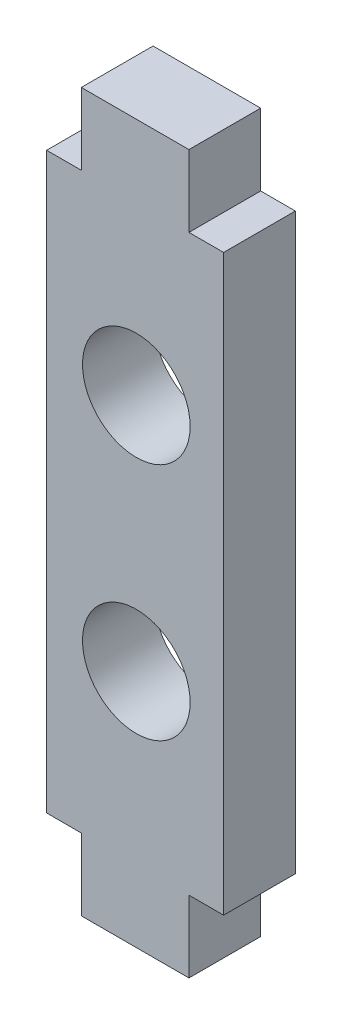
ISO-10303-21;
HEADER;
FILE_DESCRIPTION(('STEP AP214'),'2;1');
FILE_NAME('part.step','',(''),(''),'','','');
FILE_SCHEMA(('AUTOMOTIVE_DESIGN { 1 0 10303 214 1 1 1 1 }'));
ENDSEC;
DATA;
#1=APPLICATION_CONTEXT('core data for automotive mechanical design processes');
#2=APPLICATION_PROTOCOL_DEFINITION('international standard','automotive_design',2000,#1);
#3=PRODUCT_CONTEXT('',#1,'mechanical');
#4=PRODUCT('Part','Part','',(#3));
#5=PRODUCT_RELATED_PRODUCT_CATEGORY('part','',(#4));
#6=PRODUCT_DEFINITION_FORMATION('','',#4);
#7=PRODUCT_DEFINITION_CONTEXT('part definition',#1,'design');
#8=PRODUCT_DEFINITION('design','',#6,#7);
#9=PRODUCT_DEFINITION_SHAPE('','',#8);
#10=(LENGTH_UNIT() NAMED_UNIT(*) SI_UNIT(.MILLI.,.METRE.));
#11=(NAMED_UNIT(*) PLANE_ANGLE_UNIT() SI_UNIT($,.RADIAN.));
#12=(NAMED_UNIT(*) SI_UNIT($,.STERADIAN.) SOLID_ANGLE_UNIT());
#13=UNCERTAINTY_MEASURE_WITH_UNIT(LENGTH_MEASURE(1.E-05),#10,'distance_accuracy_value','');
#14=(GEOMETRIC_REPRESENTATION_CONTEXT(3) GLOBAL_UNCERTAINTY_ASSIGNED_CONTEXT((#13)) GLOBAL_UNIT_ASSIGNED_CONTEXT((#10,
#11,#12)) REPRESENTATION_CONTEXT('',''));
#15=CARTESIAN_POINT('',(0.,0.,0.));
#16=DIRECTION('',(0.,0.,1.));
#17=DIRECTION('',(1.,0.,0.));
#18=AXIS2_PLACEMENT_3D('',#15,#16,#17);
#19=CARTESIAN_POINT('',(0.,0.,3.));
#20=DIRECTION('',(0.,0.,1.));
#21=DIRECTION('',(1.,0.,0.));
#22=AXIS2_PLACEMENT_3D('',#19,#20,#21);
#23=PLANE('',#22);
#24=CARTESIAN_POINT('',(3.75,0.,3.));
#25=DIRECTION('',(0.,0.,1.));
#26=DIRECTION('',(1.,0.,0.));
#27=AXIS2_PLACEMENT_3D('',#24,#25,#26);
#28=CIRCLE('',#27,2.25);
#29=CARTESIAN_POINT('',(6.00000000000001,0.,3.));
#30=VERTEX_POINT('',#29);
#31=EDGE_CURVE('E173',#30,#30,#28,.T.);
#32=ORIENTED_EDGE('',*,*,#31,.F.);
#33=EDGE_LOOP('',(#32));
#34=FACE_BOUND('',#33,.T.);
#35=DIRECTION('',(0.,-1.,0.));
#36=VECTOR('',#35,1.);
#37=CARTESIAN_POINT('',(0.,0.,3.));
#38=LINE('',#37,#36);
#39=CARTESIAN_POINT('',(0.,7.,3.));
#40=VERTEX_POINT('',#39);
#41=CARTESIAN_POINT('',(0.,-17.,3.));
#42=VERTEX_POINT('',#41);
#43=EDGE_CURVE('E57',#40,#42,#38,.T.);
#44=ORIENTED_EDGE('',*,*,#43,.T.);
#45=DIRECTION('',(1.,0.,0.));
#46=VECTOR('',#45,1.);
#47=CARTESIAN_POINT('',(0.,-17.,3.));
#48=LINE('',#47,#46);
#49=CARTESIAN_POINT('',(1.45,-17.,3.));
#50=VERTEX_POINT('',#49);
#51=EDGE_CURVE('E113',#42,#50,#48,.T.);
#52=ORIENTED_EDGE('',*,*,#51,.T.);
#53=DIRECTION('',(0.,-1.,0.));
#54=VECTOR('',#53,1.);
#55=CARTESIAN_POINT('',(1.45,-17.,3.));
#56=LINE('',#55,#54);
#57=CARTESIAN_POINT('',(1.45,-20.,3.));
#58=VERTEX_POINT('',#57);
#59=EDGE_CURVE('E240',#50,#58,#56,.T.);
#60=ORIENTED_EDGE('',*,*,#59,.T.);
#61=DIRECTION('',(1.,0.,0.));
#62=VECTOR('',#61,1.);
#63=CARTESIAN_POINT('',(1.45,-20.,3.));
#64=LINE('',#63,#62);
#65=CARTESIAN_POINT('',(5.95,-20.,3.));
#66=VERTEX_POINT('',#65);
#67=EDGE_CURVE('E261',#58,#66,#64,.T.);
#68=ORIENTED_EDGE('',*,*,#67,.T.);
#69=DIRECTION('',(0.,1.,0.));
#70=VECTOR('',#69,1.);
#71=CARTESIAN_POINT('',(5.95,-20.,3.));
#72=LINE('',#71,#70);
#73=CARTESIAN_POINT('',(5.95,-17.,3.));
#74=VERTEX_POINT('',#73);
#75=EDGE_CURVE('E257',#66,#74,#72,.T.);
#76=ORIENTED_EDGE('',*,*,#75,.T.);
#77=DIRECTION('',(1.,0.,0.));
#78=VECTOR('',#77,1.);
#79=CARTESIAN_POINT('',(5.95,-17.,3.));
#80=LINE('',#79,#78);
#81=CARTESIAN_POINT('',(7.4,-17.,3.));
#82=VERTEX_POINT('',#81);
#83=EDGE_CURVE('E260',#74,#82,#80,.T.);
#84=ORIENTED_EDGE('',*,*,#83,.T.);
#85=DIRECTION('',(0.,1.,0.));
#86=VECTOR('',#85,1.);
#87=CARTESIAN_POINT('',(7.4,-17.,3.));
#88=LINE('',#87,#86);
#89=CARTESIAN_POINT('',(7.4,7.,3.));
#90=VERTEX_POINT('',#89);
#91=EDGE_CURVE('E265',#82,#90,#88,.T.);
#92=ORIENTED_EDGE('',*,*,#91,.T.);
#93=DIRECTION('',(-1.,0.,0.));
#94=VECTOR('',#93,1.);
#95=CARTESIAN_POINT('',(5.95,7.,3.));
#96=LINE('',#95,#94);
#97=CARTESIAN_POINT('',(5.95,7.,3.));
#98=VERTEX_POINT('',#97);
#99=EDGE_CURVE('E272',#90,#98,#96,.T.);
#100=ORIENTED_EDGE('',*,*,#99,.T.);
#101=DIRECTION('',(0.,1.,0.));
#102=VECTOR('',#101,1.);
#103=CARTESIAN_POINT('',(5.95,10.,3.));
#104=LINE('',#103,#102);
#105=CARTESIAN_POINT('',(5.95,10.,3.));
#106=VERTEX_POINT('',#105);
#107=EDGE_CURVE('E145',#98,#106,#104,.T.);
#108=ORIENTED_EDGE('',*,*,#107,.T.);
#109=DIRECTION('',(-1.,0.,0.));
#110=VECTOR('',#109,1.);
#111=CARTESIAN_POINT('',(1.45,10.,3.));
#112=LINE('',#111,#110);
#113=CARTESIAN_POINT('',(1.45,10.,3.));
#114=VERTEX_POINT('',#113);
#115=EDGE_CURVE('E139',#106,#114,#112,.T.);
#116=ORIENTED_EDGE('',*,*,#115,.T.);
#117=DIRECTION('',(0.,-1.,0.));
#118=VECTOR('',#117,1.);
#119=CARTESIAN_POINT('',(1.45,7.,3.));
#120=LINE('',#119,#118);
#121=CARTESIAN_POINT('',(1.45,7.,3.));
#122=VERTEX_POINT('',#121);
#123=EDGE_CURVE('E143',#114,#122,#120,.T.);
#124=ORIENTED_EDGE('',*,*,#123,.T.);
#125=DIRECTION('',(-1.,0.,0.));
#126=VECTOR('',#125,1.);
#127=CARTESIAN_POINT('',(0.,7.,3.));
#128=LINE('',#127,#126);
#129=EDGE_CURVE('E162',#122,#40,#128,.T.);
#130=ORIENTED_EDGE('',*,*,#129,.T.);
#131=EDGE_LOOP('',(#44,#52,#60,#68,#76,#84,#92,#100,#108,#116,#124,#130));
#132=FACE_BOUND('',#131,.T.);
#133=CARTESIAN_POINT('',(3.75,-10.,3.));
#134=DIRECTION('',(0.,0.,1.));
#135=DIRECTION('',(1.,0.,0.));
#136=AXIS2_PLACEMENT_3D('',#133,#134,#135);
#137=CIRCLE('',#136,2.25);
#138=CARTESIAN_POINT('',(6.00000000000001,-10.,3.));
#139=VERTEX_POINT('',#138);
#140=EDGE_CURVE('E297',#139,#139,#137,.T.);
#141=ORIENTED_EDGE('',*,*,#140,.F.);
#142=EDGE_LOOP('',(#141));
#143=FACE_BOUND('',#142,.T.);
#144=ADVANCED_FACE('F39',(#34,#132,#143),#23,.T.);
#145=CARTESIAN_POINT('',(0.,0.,0.));
#146=DIRECTION('',(0.,0.,1.));
#147=DIRECTION('',(1.,0.,0.));
#148=AXIS2_PLACEMENT_3D('',#145,#146,#147);
#149=PLANE('',#148);
#150=DIRECTION('',(1.,0.,0.));
#151=VECTOR('',#150,1.);
#152=CARTESIAN_POINT('',(0.,-17.,0.));
#153=LINE('',#152,#151);
#154=CARTESIAN_POINT('',(0.,-17.,0.));
#155=VERTEX_POINT('',#154);
#156=CARTESIAN_POINT('',(1.45,-17.,0.));
#157=VERTEX_POINT('',#156);
#158=EDGE_CURVE('E169',#155,#157,#153,.T.);
#159=ORIENTED_EDGE('',*,*,#158,.F.);
#160=DIRECTION('',(0.,-1.,0.));
#161=VECTOR('',#160,1.);
#162=CARTESIAN_POINT('',(0.,0.,0.));
#163=LINE('',#162,#161);
#164=CARTESIAN_POINT('',(0.,7.,0.));
#165=VERTEX_POINT('',#164);
#166=EDGE_CURVE('E201',#165,#155,#163,.T.);
#167=ORIENTED_EDGE('',*,*,#166,.F.);
#168=DIRECTION('',(-1.,0.,0.));
#169=VECTOR('',#168,1.);
#170=CARTESIAN_POINT('',(0.,7.,0.));
#171=LINE('',#170,#169);
#172=CARTESIAN_POINT('',(1.45,7.,0.));
#173=VERTEX_POINT('',#172);
#174=EDGE_CURVE('E106',#173,#165,#171,.T.);
#175=ORIENTED_EDGE('',*,*,#174,.F.);
#176=DIRECTION('',(0.,-1.,0.));
#177=VECTOR('',#176,1.);
#178=CARTESIAN_POINT('',(1.45,7.,0.));
#179=LINE('',#178,#177);
#180=CARTESIAN_POINT('',(1.45,10.,0.));
#181=VERTEX_POINT('',#180);
#182=EDGE_CURVE('E99',#181,#173,#179,.T.);
#183=ORIENTED_EDGE('',*,*,#182,.F.);
#184=DIRECTION('',(-1.,0.,0.));
#185=VECTOR('',#184,1.);
#186=CARTESIAN_POINT('',(1.45,10.,0.));
#187=LINE('',#186,#185);
#188=CARTESIAN_POINT('',(5.95,10.,0.));
#189=VERTEX_POINT('',#188);
#190=EDGE_CURVE('E154',#189,#181,#187,.T.);
#191=ORIENTED_EDGE('',*,*,#190,.F.);
#192=DIRECTION('',(0.,1.,0.));
#193=VECTOR('',#192,1.);
#194=CARTESIAN_POINT('',(5.95,10.,0.));
#195=LINE('',#194,#193);
#196=CARTESIAN_POINT('',(5.95,7.,0.));
#197=VERTEX_POINT('',#196);
#198=EDGE_CURVE('E192',#197,#189,#195,.T.);
#199=ORIENTED_EDGE('',*,*,#198,.F.);
#200=DIRECTION('',(-1.,0.,0.));
#201=VECTOR('',#200,1.);
#202=CARTESIAN_POINT('',(5.95,7.,0.));
#203=LINE('',#202,#201);
#204=CARTESIAN_POINT('',(7.4,7.,0.));
#205=VERTEX_POINT('',#204);
#206=EDGE_CURVE('E189',#205,#197,#203,.T.);
#207=ORIENTED_EDGE('',*,*,#206,.F.);
#208=DIRECTION('',(0.,1.,0.));
#209=VECTOR('',#208,1.);
#210=CARTESIAN_POINT('',(7.4,7.,0.));
#211=LINE('',#210,#209);
#212=CARTESIAN_POINT('',(7.4,-17.,0.));
#213=VERTEX_POINT('',#212);
#214=EDGE_CURVE('E186',#213,#205,#211,.T.);
#215=ORIENTED_EDGE('',*,*,#214,.F.);
#216=DIRECTION('',(1.,0.,0.));
#217=VECTOR('',#216,1.);
#218=CARTESIAN_POINT('',(5.95,-17.,0.));
#219=LINE('',#218,#217);
#220=CARTESIAN_POINT('',(5.95,-17.,0.));
#221=VERTEX_POINT('',#220);
#222=EDGE_CURVE('E182',#221,#213,#219,.T.);
#223=ORIENTED_EDGE('',*,*,#222,.F.);
#224=DIRECTION('',(0.,1.,0.));
#225=VECTOR('',#224,1.);
#226=CARTESIAN_POINT('',(5.95,-20.,0.));
#227=LINE('',#226,#225);
#228=CARTESIAN_POINT('',(5.95,-20.,0.));
#229=VERTEX_POINT('',#228);
#230=EDGE_CURVE('E179',#229,#221,#227,.T.);
#231=ORIENTED_EDGE('',*,*,#230,.F.);
#232=DIRECTION('',(1.,0.,0.));
#233=VECTOR('',#232,1.);
#234=CARTESIAN_POINT('',(1.45,-20.,0.));
#235=LINE('',#234,#233);
#236=CARTESIAN_POINT('',(1.45,-20.,0.));
#237=VERTEX_POINT('',#236);
#238=EDGE_CURVE('E176',#237,#229,#235,.T.);
#239=ORIENTED_EDGE('',*,*,#238,.F.);
#240=DIRECTION('',(0.,-1.,0.));
#241=VECTOR('',#240,1.);
#242=CARTESIAN_POINT('',(1.45,-17.,0.));
#243=LINE('',#242,#241);
#244=EDGE_CURVE('E172',#157,#237,#243,.T.);
#245=ORIENTED_EDGE('',*,*,#244,.F.);
#246=EDGE_LOOP('',(#159,#167,#175,#183,#191,#199,#207,#215,#223,#231,#239,#245));
#247=FACE_BOUND('',#246,.T.);
#248=CARTESIAN_POINT('',(3.75,0.,0.));
#249=DIRECTION('',(0.,0.,1.));
#250=DIRECTION('',(1.,0.,0.));
#251=AXIS2_PLACEMENT_3D('',#248,#249,#250);
#252=CIRCLE('',#251,2.25);
#253=CARTESIAN_POINT('',(6.00000000000001,0.,0.));
#254=VERTEX_POINT('',#253);
#255=EDGE_CURVE('E292',#254,#254,#252,.T.);
#256=ORIENTED_EDGE('',*,*,#255,.T.);
#257=EDGE_LOOP('',(#256));
#258=FACE_BOUND('',#257,.T.);
#259=CARTESIAN_POINT('',(3.75,-10.,0.));
#260=DIRECTION('',(0.,0.,1.));
#261=DIRECTION('',(1.,0.,0.));
#262=AXIS2_PLACEMENT_3D('',#259,#260,#261);
#263=CIRCLE('',#262,2.25);
#264=CARTESIAN_POINT('',(6.00000000000001,-10.,0.));
#265=VERTEX_POINT('',#264);
#266=EDGE_CURVE('E301',#265,#265,#263,.T.);
#267=ORIENTED_EDGE('',*,*,#266,.T.);
#268=EDGE_LOOP('',(#267));
#269=FACE_BOUND('',#268,.T.);
#270=ADVANCED_FACE('F244',(#247,#258,#269),#149,.F.);
#271=CARTESIAN_POINT('',(0.,-17.,3.));
#272=DIRECTION('',(0.,1.,0.));
#273=DIRECTION('',(0.,0.,1.));
#274=AXIS2_PLACEMENT_3D('',#271,#272,#273);
#275=PLANE('',#274);
#276=ORIENTED_EDGE('',*,*,#158,.T.);
#277=DIRECTION('',(0.,0.,-1.));
#278=VECTOR('',#277,1.);
#279=CARTESIAN_POINT('',(1.45,-17.,3.));
#280=LINE('',#279,#278);
#281=EDGE_CURVE('E49',#50,#157,#280,.T.);
#282=ORIENTED_EDGE('',*,*,#281,.F.);
#283=ORIENTED_EDGE('',*,*,#51,.F.);
#284=DIRECTION('',(0.,0.,-1.));
#285=VECTOR('',#284,1.);
#286=CARTESIAN_POINT('',(0.,-17.,3.));
#287=LINE('',#286,#285);
#288=EDGE_CURVE('E11',#42,#155,#287,.T.);
#289=ORIENTED_EDGE('',*,*,#288,.T.);
#290=EDGE_LOOP('',(#276,#282,#283,#289));
#291=FACE_BOUND('',#290,.T.);
#292=ADVANCED_FACE('F41',(#291),#275,.F.);
#293=CARTESIAN_POINT('',(1.45,-17.,3.));
#294=DIRECTION('',(1.,0.,0.));
#295=DIRECTION('',(0.,1.,0.));
#296=AXIS2_PLACEMENT_3D('',#293,#294,#295);
#297=PLANE('',#296);
#298=ORIENTED_EDGE('',*,*,#244,.T.);
#299=DIRECTION('',(0.,0.,-1.));
#300=VECTOR('',#299,1.);
#301=CARTESIAN_POINT('',(1.45,-20.,3.));
#302=LINE('',#301,#300);
#303=EDGE_CURVE('E230',#58,#237,#302,.T.);
#304=ORIENTED_EDGE('',*,*,#303,.F.);
#305=ORIENTED_EDGE('',*,*,#59,.F.);
#306=ORIENTED_EDGE('',*,*,#281,.T.);
#307=EDGE_LOOP('',(#298,#304,#305,#306));
#308=FACE_BOUND('',#307,.T.);
#309=ADVANCED_FACE('F238',(#308),#297,.F.);
#310=CARTESIAN_POINT('',(1.45,-20.,3.));
#311=DIRECTION('',(0.,1.,0.));
#312=DIRECTION('',(0.,0.,1.));
#313=AXIS2_PLACEMENT_3D('',#310,#311,#312);
#314=PLANE('',#313);
#315=ORIENTED_EDGE('',*,*,#238,.T.);
#316=DIRECTION('',(0.,0.,-1.));
#317=VECTOR('',#316,1.);
#318=CARTESIAN_POINT('',(5.95,-20.,3.));
#319=LINE('',#318,#317);
#320=EDGE_CURVE('E226',#66,#229,#319,.T.);
#321=ORIENTED_EDGE('',*,*,#320,.F.);
#322=ORIENTED_EDGE('',*,*,#67,.F.);
#323=ORIENTED_EDGE('',*,*,#303,.T.);
#324=EDGE_LOOP('',(#315,#321,#322,#323));
#325=FACE_BOUND('',#324,.T.);
#326=ADVANCED_FACE('F251',(#325),#314,.F.);
#327=CARTESIAN_POINT('',(5.95,-20.,3.));
#328=DIRECTION('',(-1.,0.,0.));
#329=DIRECTION('',(0.,0.,1.));
#330=AXIS2_PLACEMENT_3D('',#327,#328,#329);
#331=PLANE('',#330);
#332=ORIENTED_EDGE('',*,*,#230,.T.);
#333=DIRECTION('',(0.,0.,-1.));
#334=VECTOR('',#333,1.);
#335=CARTESIAN_POINT('',(5.95,-17.,3.));
#336=LINE('',#335,#334);
#337=EDGE_CURVE('E222',#74,#221,#336,.T.);
#338=ORIENTED_EDGE('',*,*,#337,.F.);
#339=ORIENTED_EDGE('',*,*,#75,.F.);
#340=ORIENTED_EDGE('',*,*,#320,.T.);
#341=EDGE_LOOP('',(#332,#338,#339,#340));
#342=FACE_BOUND('',#341,.T.);
#343=ADVANCED_FACE('F255',(#342),#331,.F.);
#344=CARTESIAN_POINT('',(5.95,-17.,3.));
#345=DIRECTION('',(0.,1.,0.));
#346=DIRECTION('',(0.,0.,1.));
#347=AXIS2_PLACEMENT_3D('',#344,#345,#346);
#348=PLANE('',#347);
#349=ORIENTED_EDGE('',*,*,#222,.T.);
#350=DIRECTION('',(0.,0.,-1.));
#351=VECTOR('',#350,1.);
#352=CARTESIAN_POINT('',(7.4,-17.,3.));
#353=LINE('',#352,#351);
#354=EDGE_CURVE('E218',#82,#213,#353,.T.);
#355=ORIENTED_EDGE('',*,*,#354,.F.);
#356=ORIENTED_EDGE('',*,*,#83,.F.);
#357=ORIENTED_EDGE('',*,*,#337,.T.);
#358=EDGE_LOOP('',(#349,#355,#356,#357));
#359=FACE_BOUND('',#358,.T.);
#360=ADVANCED_FACE('F338',(#359),#348,.F.);
#361=CARTESIAN_POINT('',(7.4,7.,3.));
#362=DIRECTION('',(-1.,0.,0.));
#363=DIRECTION('',(0.,-1.,0.));
#364=AXIS2_PLACEMENT_3D('',#361,#362,#363);
#365=PLANE('',#364);
#366=ORIENTED_EDGE('',*,*,#214,.T.);
#367=DIRECTION('',(0.,0.,-1.));
#368=VECTOR('',#367,1.);
#369=CARTESIAN_POINT('',(7.4,7.,3.));
#370=LINE('',#369,#368);
#371=EDGE_CURVE('E214',#90,#205,#370,.T.);
#372=ORIENTED_EDGE('',*,*,#371,.F.);
#373=ORIENTED_EDGE('',*,*,#91,.F.);
#374=ORIENTED_EDGE('',*,*,#354,.T.);
#375=EDGE_LOOP('',(#366,#372,#373,#374));
#376=FACE_BOUND('',#375,.T.);
#377=ADVANCED_FACE('F335',(#376),#365,.F.);
#378=CARTESIAN_POINT('',(5.95,7.,3.));
#379=DIRECTION('',(0.,-1.,0.));
#380=DIRECTION('',(0.,0.,-1.));
#381=AXIS2_PLACEMENT_3D('',#378,#379,#380);
#382=PLANE('',#381);
#383=ORIENTED_EDGE('',*,*,#206,.T.);
#384=DIRECTION('',(0.,0.,-1.));
#385=VECTOR('',#384,1.);
#386=CARTESIAN_POINT('',(5.95,7.,3.));
#387=LINE('',#386,#385);
#388=EDGE_CURVE('E210',#98,#197,#387,.T.);
#389=ORIENTED_EDGE('',*,*,#388,.F.);
#390=ORIENTED_EDGE('',*,*,#99,.F.);
#391=ORIENTED_EDGE('',*,*,#371,.T.);
#392=EDGE_LOOP('',(#383,#389,#390,#391));
#393=FACE_BOUND('',#392,.T.);
#394=ADVANCED_FACE('F280',(#393),#382,.F.);
#395=CARTESIAN_POINT('',(5.95,10.,3.));
#396=DIRECTION('',(-1.,0.,0.));
#397=DIRECTION('',(0.,0.,1.));
#398=AXIS2_PLACEMENT_3D('',#395,#396,#397);
#399=PLANE('',#398);
#400=ORIENTED_EDGE('',*,*,#198,.T.);
#401=DIRECTION('',(0.,0.,-1.));
#402=VECTOR('',#401,1.);
#403=CARTESIAN_POINT('',(5.95,10.,3.));
#404=LINE('',#403,#402);
#405=EDGE_CURVE('E156',#106,#189,#404,.T.);
#406=ORIENTED_EDGE('',*,*,#405,.F.);
#407=ORIENTED_EDGE('',*,*,#107,.F.);
#408=ORIENTED_EDGE('',*,*,#388,.T.);
#409=EDGE_LOOP('',(#400,#406,#407,#408));
#410=FACE_BOUND('',#409,.T.);
#411=ADVANCED_FACE('F284',(#410),#399,.F.);
#412=CARTESIAN_POINT('',(1.45,10.,3.));
#413=DIRECTION('',(0.,-1.,0.));
#414=DIRECTION('',(1.,0.,0.));
#415=AXIS2_PLACEMENT_3D('',#412,#413,#414);
#416=PLANE('',#415);
#417=ORIENTED_EDGE('',*,*,#190,.T.);
#418=DIRECTION('',(0.,0.,-1.));
#419=VECTOR('',#418,1.);
#420=CARTESIAN_POINT('',(1.45,10.,3.));
#421=LINE('',#420,#419);
#422=EDGE_CURVE('E151',#114,#181,#421,.T.);
#423=ORIENTED_EDGE('',*,*,#422,.F.);
#424=ORIENTED_EDGE('',*,*,#115,.F.);
#425=ORIENTED_EDGE('',*,*,#405,.T.);
#426=EDGE_LOOP('',(#417,#423,#424,#425));
#427=FACE_BOUND('',#426,.T.);
#428=ADVANCED_FACE('F152',(#427),#416,.F.);
#429=CARTESIAN_POINT('',(1.45,7.,3.));
#430=DIRECTION('',(1.,0.,0.));
#431=DIRECTION('',(0.,0.,-1.));
#432=AXIS2_PLACEMENT_3D('',#429,#430,#431);
#433=PLANE('',#432);
#434=ORIENTED_EDGE('',*,*,#182,.T.);
#435=DIRECTION('',(0.,0.,-1.));
#436=VECTOR('',#435,1.);
#437=CARTESIAN_POINT('',(1.45,7.,3.));
#438=LINE('',#437,#436);
#439=EDGE_CURVE('E157',#122,#173,#438,.T.);
#440=ORIENTED_EDGE('',*,*,#439,.F.);
#441=ORIENTED_EDGE('',*,*,#123,.F.);
#442=ORIENTED_EDGE('',*,*,#422,.T.);
#443=EDGE_LOOP('',(#434,#440,#441,#442));
#444=FACE_BOUND('',#443,.T.);
#445=ADVANCED_FACE('F159',(#444),#433,.F.);
#446=CARTESIAN_POINT('',(0.,7.,3.));
#447=DIRECTION('',(0.,-1.,0.));
#448=DIRECTION('',(0.,0.,-1.));
#449=AXIS2_PLACEMENT_3D('',#446,#447,#448);
#450=PLANE('',#449);
#451=ORIENTED_EDGE('',*,*,#174,.T.);
#452=DIRECTION('',(0.,0.,-1.));
#453=VECTOR('',#452,1.);
#454=CARTESIAN_POINT('',(0.,7.,3.));
#455=LINE('',#454,#453);
#456=EDGE_CURVE('E165',#40,#165,#455,.T.);
#457=ORIENTED_EDGE('',*,*,#456,.F.);
#458=ORIENTED_EDGE('',*,*,#129,.F.);
#459=ORIENTED_EDGE('',*,*,#439,.T.);
#460=EDGE_LOOP('',(#451,#457,#458,#459));
#461=FACE_BOUND('',#460,.T.);
#462=ADVANCED_FACE('F286',(#461),#450,.F.);
#463=CARTESIAN_POINT('',(0.,0.,3.));
#464=DIRECTION('',(1.,0.,0.));
#465=DIRECTION('',(0.,0.,-1.));
#466=AXIS2_PLACEMENT_3D('',#463,#464,#465);
#467=PLANE('',#466);
#468=ORIENTED_EDGE('',*,*,#166,.T.);
#469=ORIENTED_EDGE('',*,*,#288,.F.);
#470=ORIENTED_EDGE('',*,*,#43,.F.);
#471=ORIENTED_EDGE('',*,*,#456,.T.);
#472=EDGE_LOOP('',(#468,#469,#470,#471));
#473=FACE_BOUND('',#472,.T.);
#474=ADVANCED_FACE('F285',(#473),#467,.F.);
#475=CARTESIAN_POINT('',(3.75,0.,3.));
#476=DIRECTION('',(0.,0.,-1.));
#477=DIRECTION('',(-1.,0.,0.));
#478=AXIS2_PLACEMENT_3D('',#475,#476,#477);
#479=CYLINDRICAL_SURFACE('',#478,2.25);
#480=ORIENTED_EDGE('',*,*,#31,.T.);
#481=EDGE_LOOP('',(#480));
#482=FACE_BOUND('',#481,.T.);
#483=ORIENTED_EDGE('',*,*,#255,.F.);
#484=EDGE_LOOP('',(#483));
#485=FACE_BOUND('',#484,.T.);
#486=ADVANCED_FACE('F320',(#482,#485),#479,.F.);
#487=CARTESIAN_POINT('',(3.75,-10.,3.));
#488=DIRECTION('',(0.,0.,-1.));
#489=DIRECTION('',(-1.,0.,0.));
#490=AXIS2_PLACEMENT_3D('',#487,#488,#489);
#491=CYLINDRICAL_SURFACE('',#490,2.25);
#492=ORIENTED_EDGE('',*,*,#140,.T.);
#493=EDGE_LOOP('',(#492));
#494=FACE_BOUND('',#493,.T.);
#495=ORIENTED_EDGE('',*,*,#266,.F.);
#496=EDGE_LOOP('',(#495));
#497=FACE_BOUND('',#496,.T.);
#498=ADVANCED_FACE('F309',(#494,#497),#491,.F.);
#499=CLOSED_SHELL('',(#144,#270,#292,#309,#326,#343,#360,#377,#394,#411,#428,#445,#462,#474,
#486,#498));
#500=MANIFOLD_SOLID_BREP('B2',#499);
#501=ADVANCED_BREP_SHAPE_REPRESENTATION('',(#18,#500),#14);
#502=SHAPE_DEFINITION_REPRESENTATION(#9,#501);
ENDSEC;
END-ISO-10303-21;
